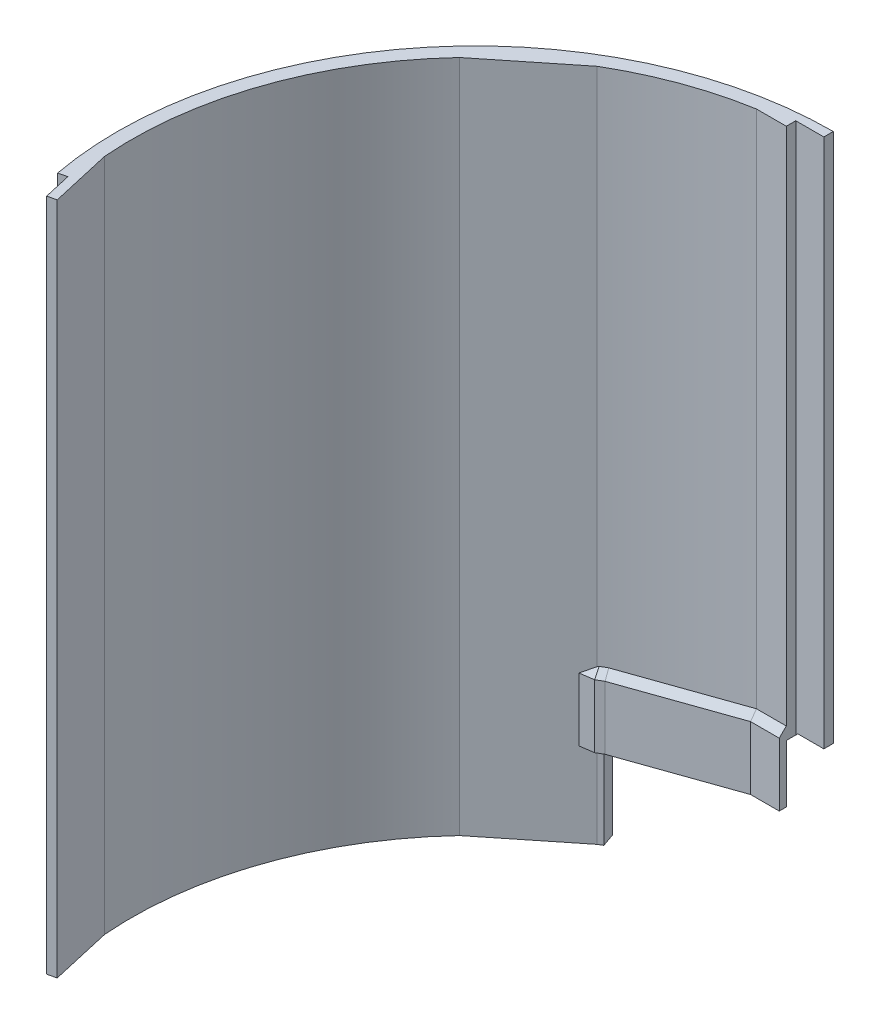
ISO-10303-21;
HEADER;
FILE_DESCRIPTION(('STEP AP214'),'2;1');
FILE_NAME('part.step','',(''),(''),'','','');
FILE_SCHEMA(('AUTOMOTIVE_DESIGN { 1 0 10303 214 1 1 1 1 }'));
ENDSEC;
DATA;
#1=APPLICATION_CONTEXT('core data for automotive mechanical design processes');
#2=APPLICATION_PROTOCOL_DEFINITION('international standard','automotive_design',2000,#1);
#3=PRODUCT_CONTEXT('',#1,'mechanical');
#4=PRODUCT('Part','Part','',(#3));
#5=PRODUCT_RELATED_PRODUCT_CATEGORY('part','',(#4));
#6=PRODUCT_DEFINITION_FORMATION('','',#4);
#7=PRODUCT_DEFINITION_CONTEXT('part definition',#1,'design');
#8=PRODUCT_DEFINITION('design','',#6,#7);
#9=PRODUCT_DEFINITION_SHAPE('','',#8);
#10=(LENGTH_UNIT() NAMED_UNIT(*) SI_UNIT(.MILLI.,.METRE.));
#11=(NAMED_UNIT(*) PLANE_ANGLE_UNIT() SI_UNIT($,.RADIAN.));
#12=(NAMED_UNIT(*) SI_UNIT($,.STERADIAN.) SOLID_ANGLE_UNIT());
#13=UNCERTAINTY_MEASURE_WITH_UNIT(LENGTH_MEASURE(1.E-05),#10,'distance_accuracy_value','');
#14=(GEOMETRIC_REPRESENTATION_CONTEXT(3) GLOBAL_UNCERTAINTY_ASSIGNED_CONTEXT((#13)) GLOBAL_UNIT_ASSIGNED_CONTEXT((#10,
#11,#12)) REPRESENTATION_CONTEXT('',''));
#15=CARTESIAN_POINT('',(0.,0.,0.));
#16=DIRECTION('',(0.,0.,1.));
#17=DIRECTION('',(1.,0.,0.));
#18=AXIS2_PLACEMENT_3D('',#15,#16,#17);
#19=CARTESIAN_POINT('',(0.,177.838869574608,0.));
#20=DIRECTION('',(0.,-1.,0.));
#21=DIRECTION('',(0.,0.,-1.));
#22=AXIS2_PLACEMENT_3D('',#19,#20,#21);
#23=CYLINDRICAL_SURFACE('',#22,49.);
#24=DIRECTION('',(0.,-1.,0.));
#25=VECTOR('',#24,1.);
#26=CARTESIAN_POINT('',(-23.8221858110528,22.,-42.8194285714286));
#27=LINE('',#26,#25);
#28=CARTESIAN_POINT('',(-23.8221858110528,22.,-42.8194285714286));
#29=VERTEX_POINT('',#28);
#30=CARTESIAN_POINT('',(-23.8221858110528,14.7071067811866,-42.8194285714286));
#31=VERTEX_POINT('',#30);
#32=EDGE_CURVE('E456',#29,#31,#27,.T.);
#33=ORIENTED_EDGE('',*,*,#32,.T.);
#34=CARTESIAN_POINT('',(0.,22.9599850669726,0.));
#35=DIRECTION('',(-0.666989294417188,0.707106781186547,0.234787736334038));
#36=DIRECTION('',(-0.666989294417188,-0.707106781186548,0.234787736334037));
#37=AXIS2_PLACEMENT_3D('',#34,#35,#36);
#38=ELLIPSE('',#37,69.2964645562817,49.);
#39=CARTESIAN_POINT('',(-21.3188530280703,17.5,-44.1192305640923));
#40=VERTEX_POINT('',#39);
#41=EDGE_CURVE('E507',#31,#40,#38,.F.);
#42=ORIENTED_EDGE('',*,*,#41,.T.);
#43=CARTESIAN_POINT('',(0.,17.5,0.));
#44=DIRECTION('',(0.,1.,0.));
#45=DIRECTION('',(0.,0.,1.));
#46=AXIS2_PLACEMENT_3D('',#43,#44,#45);
#47=CIRCLE('',#46,49.);
#48=CARTESIAN_POINT('',(-8.25287828578612,17.5,-48.3));
#49=VERTEX_POINT('',#48);
#50=EDGE_CURVE('E504',#40,#49,#47,.F.);
#51=ORIENTED_EDGE('',*,*,#50,.T.);
#52=DIRECTION('',(0.,-1.,0.));
#53=VECTOR('',#52,1.);
#54=CARTESIAN_POINT('',(-8.25287828578612,22.,-48.3));
#55=LINE('',#54,#53);
#56=CARTESIAN_POINT('',(-8.25287828578612,22.,-48.3));
#57=VERTEX_POINT('',#56);
#58=EDGE_CURVE('E463',#57,#49,#55,.T.);
#59=ORIENTED_EDGE('',*,*,#58,.F.);
#60=DIRECTION('',(0.,-1.,0.));
#61=VECTOR('',#60,1.);
#62=CARTESIAN_POINT('',(-8.25287828578612,177.838869574608,-48.3));
#63=LINE('',#62,#61);
#64=CARTESIAN_POINT('',(-8.25287828578612,96.,-48.3));
#65=VERTEX_POINT('',#64);
#66=EDGE_CURVE('E274',#65,#57,#63,.T.);
#67=ORIENTED_EDGE('',*,*,#66,.F.);
#68=CARTESIAN_POINT('',(0.,96.,0.));
#69=DIRECTION('',(0.,1.,0.));
#70=DIRECTION('',(0.,0.,1.));
#71=AXIS2_PLACEMENT_3D('',#68,#69,#70);
#72=CIRCLE('',#71,49.);
#73=CARTESIAN_POINT('',(-24.8620843048441,96.,-42.2241253789682));
#74=VERTEX_POINT('',#73);
#75=EDGE_CURVE('E364',#74,#65,#72,.F.);
#76=ORIENTED_EDGE('',*,*,#75,.F.);
#77=DIRECTION('',(0.,-1.,0.));
#78=VECTOR('',#77,1.);
#79=CARTESIAN_POINT('',(-24.8620843048441,177.838869574608,-42.2241253789682));
#80=LINE('',#79,#78);
#81=CARTESIAN_POINT('',(-24.8620843048441,21.9284345325406,-42.2241253789682));
#82=VERTEX_POINT('',#81);
#83=EDGE_CURVE('E100',#74,#82,#80,.T.);
#84=ORIENTED_EDGE('',*,*,#83,.T.);
#85=CARTESIAN_POINT('',(0.,-23.5648575619474,0.));
#86=DIRECTION('',(-0.106740245237132,-0.707106781186545,-0.699003948520121));
#87=DIRECTION('',(0.106740245237131,-0.70710678118655,0.699003948520117));
#88=AXIS2_PLACEMENT_3D('',#85,#86,#87);
#89=ELLIPSE('',#88,69.2964645562819,49.);
#90=CARTESIAN_POINT('',(-24.6950644021561,22.,-42.3220249299743));
#91=VERTEX_POINT('',#90);
#92=EDGE_CURVE('E12',#82,#91,#89,.T.);
#93=ORIENTED_EDGE('',*,*,#92,.T.);
#94=CARTESIAN_POINT('',(0.,22.,0.));
#95=DIRECTION('',(0.,1.,0.));
#96=DIRECTION('',(0.,0.,1.));
#97=AXIS2_PLACEMENT_3D('',#94,#95,#96);
#98=CIRCLE('',#97,49.);
#99=EDGE_CURVE('E448',#29,#91,#98,.T.);
#100=ORIENTED_EDGE('',*,*,#99,.F.);
#101=EDGE_LOOP('',(#33,#42,#51,#59,#67,#76,#84,#93,#100));
#102=FACE_BOUND('',#101,.T.);
#103=ADVANCED_FACE('F83',(#102),#23,.F.);
#104=CARTESIAN_POINT('',(0.,12.,0.));
#105=DIRECTION('',(0.,1.,0.));
#106=DIRECTION('',(0.,0.,1.));
#107=AXIS2_PLACEMENT_3D('',#104,#105,#106);
#108=CIRCLE('',#107,49.);
#109=CARTESIAN_POINT('',(-24.2645651205459,12.,-42.5703051376283));
#110=VERTEX_POINT('',#109);
#111=CARTESIAN_POINT('',(-24.8620843048441,12.,-42.2241253789682));
#112=VERTEX_POINT('',#111);
#113=EDGE_CURVE('E595',#110,#112,#108,.T.);
#114=ORIENTED_EDGE('',*,*,#113,.T.);
#115=CARTESIAN_POINT('',(-24.8620843048441,0.,-42.2241253789682));
#116=VERTEX_POINT('',#115);
#117=EDGE_CURVE('E409',#112,#116,#80,.T.);
#118=ORIENTED_EDGE('',*,*,#117,.T.);
#119=CARTESIAN_POINT('',(0.,0.,0.));
#120=DIRECTION('',(0.,1.,0.));
#121=DIRECTION('',(0.,0.,1.));
#122=AXIS2_PLACEMENT_3D('',#119,#120,#121);
#123=CIRCLE('',#122,49.);
#124=CARTESIAN_POINT('',(-24.2645651205459,0.,-42.5703051376283));
#125=VERTEX_POINT('',#124);
#126=EDGE_CURVE('E376',#116,#125,#123,.F.);
#127=ORIENTED_EDGE('',*,*,#126,.T.);
#128=DIRECTION('',(0.,-1.,0.));
#129=VECTOR('',#128,1.);
#130=CARTESIAN_POINT('',(-24.2645651205459,177.838869574608,-42.5703051376283));
#131=LINE('',#130,#129);
#132=EDGE_CURVE('E499',#125,#110,#131,.F.);
#133=ORIENTED_EDGE('',*,*,#132,.T.);
#134=EDGE_LOOP('',(#114,#118,#127,#133));
#135=FACE_BOUND('',#134,.T.);
#136=ADVANCED_FACE('F335',(#135),#23,.F.);
#137=CARTESIAN_POINT('',(0.,0.,0.));
#138=DIRECTION('',(0.,1.,0.));
#139=DIRECTION('',(0.,0.,1.));
#140=AXIS2_PLACEMENT_3D('',#137,#138,#139);
#141=PLANE('',#140);
#142=CARTESIAN_POINT('',(0.,0.,0.));
#143=DIRECTION('',(0.,1.,0.));
#144=DIRECTION('',(0.,0.,1.));
#145=AXIS2_PLACEMENT_3D('',#142,#143,#144);
#146=CIRCLE('',#145,51.);
#147=CARTESIAN_POINT('',(-24.9390649476221,0.,-44.4864365794597));
#148=VERTEX_POINT('',#147);
#149=CARTESIAN_POINT('',(-50.1311597152052,0.,9.37373061318611));
#150=VERTEX_POINT('',#149);
#151=EDGE_CURVE('E388',#148,#150,#146,.T.);
#152=ORIENTED_EDGE('',*,*,#151,.F.);
#153=DIRECTION('',(0.332040001002474,0.,0.943265306122449));
#154=VECTOR('',#153,1.);
#155=CARTESIAN_POINT('',(-8.25628641569455,0.,2.90630571478695));
#156=LINE('',#155,#154);
#157=EDGE_CURVE('E410',#148,#125,#156,.T.);
#158=ORIENTED_EDGE('',*,*,#157,.T.);
#159=ORIENTED_EDGE('',*,*,#126,.F.);
#160=DIRECTION('',(0.7806247497998,0.,-0.625));
#161=VECTOR('',#160,1.);
#162=CARTESIAN_POINT('',(-30.3125,0.,-37.8603003652903));
#163=LINE('',#162,#161);
#164=CARTESIAN_POINT('',(-35.7629156951558,0.,-33.4964753516124));
#165=VERTEX_POINT('',#164);
#166=EDGE_CURVE('E407',#165,#116,#163,.T.);
#167=ORIENTED_EDGE('',*,*,#166,.F.);
#168=CARTESIAN_POINT('',(0.,0.,0.));
#169=DIRECTION('',(0.,1.,0.));
#170=DIRECTION('',(0.,0.,1.));
#171=AXIS2_PLACEMENT_3D('',#168,#169,#170);
#172=CIRCLE('',#171,49.);
#173=CARTESIAN_POINT('',(-48.8389610049885,0.,3.96936870965767));
#174=VERTEX_POINT('',#173);
#175=EDGE_CURVE('E404',#174,#165,#172,.F.);
#176=ORIENTED_EDGE('',*,*,#175,.F.);
#177=DIRECTION('',(-0.222204860432889,0.,-0.975));
#178=VECTOR('',#177,1.);
#179=CARTESIAN_POINT('',(-47.2875,0.,10.7769357309951));
#180=LINE('',#179,#178);
#181=CARTESIAN_POINT('',(-46.8430902791342,0.,12.7269357309953));
#182=VERTEX_POINT('',#181);
#183=EDGE_CURVE('E401',#182,#174,#180,.T.);
#184=ORIENTED_EDGE('',*,*,#183,.F.);
#185=DIRECTION('',(-0.975,0.,0.222204860432889));
#186=VECTOR('',#185,1.);
#187=CARTESIAN_POINT('',(0.44440972086582,0.,1.95000000000019));
#188=LINE('',#187,#186);
#189=CARTESIAN_POINT('',(-48.0618402791341,0.,13.0046918065364));
#190=VERTEX_POINT('',#189);
#191=EDGE_CURVE('E513',#182,#190,#188,.T.);
#192=ORIENTED_EDGE('',*,*,#191,.T.);
#193=DIRECTION('',(-0.222204860432907,0.,-0.974999999999996));
#194=VECTOR('',#193,1.);
#195=CARTESIAN_POINT('',(-48.5062499999998,0.,11.0546918065371));
#196=LINE('',#195,#194);
#197=CARTESIAN_POINT('',(-48.9506597208657,0.,9.10469180653663));
#198=VERTEX_POINT('',#197);
#199=EDGE_CURVE('E372',#190,#198,#196,.T.);
#200=ORIENTED_EDGE('',*,*,#199,.T.);
#201=DIRECTION('',(-0.975,0.,0.222204860432891));
#202=VECTOR('',#201,1.);
#203=CARTESIAN_POINT('',(-0.444409720865719,0.,-1.94999999999972));
#204=LINE('',#203,#202);
#205=EDGE_CURVE('E367',#198,#150,#204,.T.);
#206=ORIENTED_EDGE('',*,*,#205,.T.);
#207=EDGE_LOOP('',(#152,#158,#159,#167,#176,#184,#192,#200,#206));
#208=FACE_BOUND('',#207,.T.);
#209=ADVANCED_FACE('F340',(#208),#141,.F.);
#210=CARTESIAN_POINT('',(0.,177.838869574608,-48.3));
#211=DIRECTION('',(0.,0.,-1.));
#212=DIRECTION('',(-1.,0.,0.));
#213=AXIS2_PLACEMENT_3D('',#210,#211,#212);
#214=PLANE('',#213);
#215=ORIENTED_EDGE('',*,*,#66,.T.);
#216=DIRECTION('',(-1.,0.,0.));
#217=VECTOR('',#216,1.);
#218=CARTESIAN_POINT('',(0.,22.,-48.3));
#219=LINE('',#218,#217);
#220=CARTESIAN_POINT('',(-3.99999999999999,22.,-48.3));
#221=VERTEX_POINT('',#220);
#222=EDGE_CURVE('E269',#221,#57,#219,.T.);
#223=ORIENTED_EDGE('',*,*,#222,.F.);
#224=DIRECTION('',(0.,-1.,0.));
#225=VECTOR('',#224,1.);
#226=CARTESIAN_POINT('',(-3.99999999999999,177.838869574608,-48.3));
#227=LINE('',#226,#225);
#228=CARTESIAN_POINT('',(-3.99999999999999,96.,-48.3));
#229=VERTEX_POINT('',#228);
#230=EDGE_CURVE('E271',#229,#221,#227,.T.);
#231=ORIENTED_EDGE('',*,*,#230,.F.);
#232=DIRECTION('',(1.,0.,0.));
#233=VECTOR('',#232,1.);
#234=CARTESIAN_POINT('',(0.,96.,-48.3));
#235=LINE('',#234,#233);
#236=EDGE_CURVE('E369',#65,#229,#235,.T.);
#237=ORIENTED_EDGE('',*,*,#236,.F.);
#238=EDGE_LOOP('',(#215,#223,#231,#237));
#239=FACE_BOUND('',#238,.T.);
#240=ADVANCED_FACE('F270',(#239),#214,.F.);
#241=CARTESIAN_POINT('',(-3.99999999999999,177.838869574608,0.));
#242=DIRECTION('',(1.,0.,0.));
#243=DIRECTION('',(0.,0.,-1.));
#244=AXIS2_PLACEMENT_3D('',#241,#242,#243);
#245=PLANE('',#244);
#246=ORIENTED_EDGE('',*,*,#230,.T.);
#247=DIRECTION('',(0.,-0.707106781186552,0.707106781186543));
#248=VECTOR('',#247,1.);
#249=CARTESIAN_POINT('',(-3.99999999999999,75.7694347873051,-102.069434787304));
#250=LINE('',#249,#248);
#251=CARTESIAN_POINT('',(-4.,21.,-47.3));
#252=VERTEX_POINT('',#251);
#253=EDGE_CURVE('E108',#221,#252,#250,.T.);
#254=ORIENTED_EDGE('',*,*,#253,.T.);
#255=DIRECTION('',(0.,-1.,0.));
#256=VECTOR('',#255,1.);
#257=CARTESIAN_POINT('',(-4.,22.,-47.3));
#258=LINE('',#257,#256);
#259=CARTESIAN_POINT('',(-4.,12.,-47.3));
#260=VERTEX_POINT('',#259);
#261=EDGE_CURVE('E468',#252,#260,#258,.T.);
#262=ORIENTED_EDGE('',*,*,#261,.T.);
#263=DIRECTION('',(0.,0.,1.));
#264=VECTOR('',#263,1.);
#265=CARTESIAN_POINT('',(-4.00000000000045,12.,0.));
#266=LINE('',#265,#264);
#267=CARTESIAN_POINT('',(-3.99999999999999,12.,-48.3));
#268=VERTEX_POINT('',#267);
#269=EDGE_CURVE('E605',#268,#260,#266,.T.);
#270=ORIENTED_EDGE('',*,*,#269,.F.);
#271=DIRECTION('',(0.,-1.,0.));
#272=VECTOR('',#271,1.);
#273=CARTESIAN_POINT('',(-3.99999999999999,22.,-48.3));
#274=LINE('',#273,#272);
#275=CARTESIAN_POINT('',(-3.99999999999999,20.2071067811866,-48.3));
#276=VERTEX_POINT('',#275);
#277=EDGE_CURVE('E466',#276,#268,#274,.T.);
#278=ORIENTED_EDGE('',*,*,#277,.F.);
#279=DIRECTION('',(0.,0.,1.));
#280=VECTOR('',#279,1.);
#281=CARTESIAN_POINT('',(-3.99999999999999,20.2071067811866,0.));
#282=LINE('',#281,#280);
#283=CARTESIAN_POINT('',(-3.99999999999999,20.2071067811865,-49.65));
#284=VERTEX_POINT('',#283);
#285=EDGE_CURVE('E485',#284,#276,#282,.T.);
#286=ORIENTED_EDGE('',*,*,#285,.F.);
#287=DIRECTION('',(0.,-1.,0.));
#288=VECTOR('',#287,1.);
#289=CARTESIAN_POINT('',(-3.99999999999999,177.838869574608,-49.65));
#290=LINE('',#289,#288);
#291=CARTESIAN_POINT('',(-3.99999999999999,96.,-49.65));
#292=VERTEX_POINT('',#291);
#293=EDGE_CURVE('E378',#292,#284,#290,.T.);
#294=ORIENTED_EDGE('',*,*,#293,.F.);
#295=DIRECTION('',(0.,0.,1.));
#296=VECTOR('',#295,1.);
#297=CARTESIAN_POINT('',(-3.99999999999999,96.,0.));
#298=LINE('',#297,#296);
#299=EDGE_CURVE('E284',#292,#229,#298,.T.);
#300=ORIENTED_EDGE('',*,*,#299,.T.);
#301=EDGE_LOOP('',(#246,#254,#262,#270,#278,#286,#294,#300));
#302=FACE_BOUND('',#301,.T.);
#303=ADVANCED_FACE('F281',(#302),#245,.T.);
#304=CARTESIAN_POINT('',(0.,177.838869574608,-49.65));
#305=DIRECTION('',(0.,0.,1.));
#306=DIRECTION('',(1.,0.,0.));
#307=AXIS2_PLACEMENT_3D('',#304,#305,#306);
#308=PLANE('',#307);
#309=DIRECTION('',(-1.,0.,0.));
#310=VECTOR('',#309,1.);
#311=CARTESIAN_POINT('',(-1.47251992912578E-13,20.5,-49.65));
#312=LINE('',#311,#310);
#313=CARTESIAN_POINT('',(0.,20.5,-49.65));
#314=VERTEX_POINT('',#313);
#315=CARTESIAN_POINT('',(-3.70710678118655,20.5,-49.65));
#316=VERTEX_POINT('',#315);
#317=EDGE_CURVE('E488',#314,#316,#312,.T.);
#318=ORIENTED_EDGE('',*,*,#317,.F.);
#319=DIRECTION('',(0.,-1.,0.));
#320=VECTOR('',#319,1.);
#321=CARTESIAN_POINT('',(0.,177.838869574608,-49.65));
#322=LINE('',#321,#320);
#323=CARTESIAN_POINT('',(0.,96.,-49.65));
#324=VERTEX_POINT('',#323);
#325=EDGE_CURVE('E382',#324,#314,#322,.T.);
#326=ORIENTED_EDGE('',*,*,#325,.F.);
#327=DIRECTION('',(-1.,0.,0.));
#328=VECTOR('',#327,1.);
#329=CARTESIAN_POINT('',(0.,96.,-49.65));
#330=LINE('',#329,#328);
#331=EDGE_CURVE('E285',#324,#292,#330,.T.);
#332=ORIENTED_EDGE('',*,*,#331,.T.);
#333=ORIENTED_EDGE('',*,*,#293,.T.);
#334=DIRECTION('',(-0.70710678118655,-0.707106781186545,0.));
#335=VECTOR('',#334,1.);
#336=CARTESIAN_POINT('',(76.8158813967108,101.022988177897,-49.65));
#337=LINE('',#336,#335);
#338=EDGE_CURVE('E479',#316,#284,#337,.T.);
#339=ORIENTED_EDGE('',*,*,#338,.F.);
#340=EDGE_LOOP('',(#318,#326,#332,#333,#339));
#341=FACE_BOUND('',#340,.T.);
#342=ADVANCED_FACE('F559',(#341),#308,.T.);
#343=CARTESIAN_POINT('',(0.,177.838869574608,0.));
#344=DIRECTION('',(1.,0.,0.));
#345=DIRECTION('',(0.,0.,-1.));
#346=AXIS2_PLACEMENT_3D('',#343,#344,#345);
#347=PLANE('',#346);
#348=DIRECTION('',(0.,0.,1.));
#349=VECTOR('',#348,1.);
#350=CARTESIAN_POINT('',(0.,20.5,-51.));
#351=LINE('',#350,#349);
#352=CARTESIAN_POINT('',(0.,20.5,-51.));
#353=VERTEX_POINT('',#352);
#354=EDGE_CURVE('E475',#353,#314,#351,.T.);
#355=ORIENTED_EDGE('',*,*,#354,.F.);
#356=DIRECTION('',(0.,-1.,0.));
#357=VECTOR('',#356,1.);
#358=CARTESIAN_POINT('',(0.,177.838869574608,-51.));
#359=LINE('',#358,#357);
#360=CARTESIAN_POINT('',(0.,96.,-51.));
#361=VERTEX_POINT('',#360);
#362=EDGE_CURVE('E385',#361,#353,#359,.T.);
#363=ORIENTED_EDGE('',*,*,#362,.F.);
#364=DIRECTION('',(0.,0.,1.));
#365=VECTOR('',#364,1.);
#366=CARTESIAN_POINT('',(0.,96.,0.));
#367=LINE('',#366,#365);
#368=EDGE_CURVE('E381',#361,#324,#367,.T.);
#369=ORIENTED_EDGE('',*,*,#368,.T.);
#370=ORIENTED_EDGE('',*,*,#325,.T.);
#371=EDGE_LOOP('',(#355,#363,#369,#370));
#372=FACE_BOUND('',#371,.T.);
#373=ADVANCED_FACE('F566',(#372),#347,.T.);
#374=CARTESIAN_POINT('',(0.,177.838869574608,0.));
#375=DIRECTION('',(0.,-1.,0.));
#376=DIRECTION('',(0.,0.,-1.));
#377=AXIS2_PLACEMENT_3D('',#374,#375,#376);
#378=CYLINDRICAL_SURFACE('',#377,51.);
#379=ORIENTED_EDGE('',*,*,#362,.T.);
#380=CARTESIAN_POINT('',(0.,20.5,0.));
#381=DIRECTION('',(0.,1.,0.));
#382=DIRECTION('',(-1.,0.,0.));
#383=AXIS2_PLACEMENT_3D('',#380,#381,#382);
#384=CIRCLE('',#383,51.);
#385=CARTESIAN_POINT('',(-3.70710678118655,20.5,-50.8650897896866));
#386=VERTEX_POINT('',#385);
#387=EDGE_CURVE('E421',#353,#386,#384,.T.);
#388=ORIENTED_EDGE('',*,*,#387,.T.);
#389=CARTESIAN_POINT('',(0.,24.2071067811865,0.));
#390=DIRECTION('',(-0.707106781186545,0.70710678118655,0.));
#391=DIRECTION('',(-0.70710678118655,-0.707106781186545,0.));
#392=AXIS2_PLACEMENT_3D('',#389,#390,#391);
#393=ELLIPSE('',#392,72.1248916810276,51.);
#394=CARTESIAN_POINT('',(-6.70710678118656,17.5,-50.5570442038076));
#395=VERTEX_POINT('',#394);
#396=EDGE_CURVE('E418',#386,#395,#393,.T.);
#397=ORIENTED_EDGE('',*,*,#396,.T.);
#398=CARTESIAN_POINT('',(0.,17.5,0.));
#399=DIRECTION('',(0.,1.,0.));
#400=DIRECTION('',(0.,0.,1.));
#401=AXIS2_PLACEMENT_3D('',#398,#399,#400);
#402=CIRCLE('',#401,51.);
#403=CARTESIAN_POINT('',(-21.9869298650982,17.5,-46.0171154583515));
#404=VERTEX_POINT('',#403);
#405=EDGE_CURVE('E413',#395,#404,#402,.T.);
#406=ORIENTED_EDGE('',*,*,#405,.T.);
#407=CARTESIAN_POINT('',(0.,22.9599850669726,0.));
#408=DIRECTION('',(-0.666989294417188,0.707106781186547,0.234787736334038));
#409=DIRECTION('',(-0.666989294417188,-0.707106781186548,0.234787736334037));
#410=AXIS2_PLACEMENT_3D('',#407,#408,#409);
#411=ELLIPSE('',#410,72.1248916810279,51.);
#412=CARTESIAN_POINT('',(-24.9390649476221,14.2071067811865,-44.4864365794596));
#413=VERTEX_POINT('',#412);
#414=EDGE_CURVE('E415',#404,#413,#411,.T.);
#415=ORIENTED_EDGE('',*,*,#414,.T.);
#416=DIRECTION('',(0.,-1.,0.));
#417=VECTOR('',#416,1.);
#418=CARTESIAN_POINT('',(-24.9390649476221,177.838869574608,-44.4864365794597));
#419=LINE('',#418,#417);
#420=EDGE_CURVE('E493',#413,#148,#419,.T.);
#421=ORIENTED_EDGE('',*,*,#420,.T.);
#422=ORIENTED_EDGE('',*,*,#151,.T.);
#423=DIRECTION('',(0.,-1.,0.));
#424=VECTOR('',#423,1.);
#425=CARTESIAN_POINT('',(-50.1311597152052,177.838869574608,9.37373061318611));
#426=LINE('',#425,#424);
#427=CARTESIAN_POINT('',(-50.1311597152052,96.,9.37373061318611));
#428=VERTEX_POINT('',#427);
#429=EDGE_CURVE('E389',#428,#150,#426,.T.);
#430=ORIENTED_EDGE('',*,*,#429,.F.);
#431=CARTESIAN_POINT('',(0.,96.,0.));
#432=DIRECTION('',(0.,1.,0.));
#433=DIRECTION('',(0.,0.,1.));
#434=AXIS2_PLACEMENT_3D('',#431,#432,#433);
#435=CIRCLE('',#434,51.);
#436=EDGE_CURVE('E528',#361,#428,#435,.T.);
#437=ORIENTED_EDGE('',*,*,#436,.F.);
#438=EDGE_LOOP('',(#379,#388,#397,#406,#415,#421,#422,#430,#437));
#439=FACE_BOUND('',#438,.T.);
#440=ADVANCED_FACE('F568',(#439),#378,.T.);
#441=CARTESIAN_POINT('',(-0.444409720865719,177.838869574608,-1.94999999999972));
#442=DIRECTION('',(0.222204860432891,0.,0.975));
#443=DIRECTION('',(0.975,0.,-0.222204860432891));
#444=AXIS2_PLACEMENT_3D('',#441,#442,#443);
#445=PLANE('',#444);
#446=DIRECTION('',(0.,-1.,0.));
#447=VECTOR('',#446,1.);
#448=CARTESIAN_POINT('',(-48.9506597208657,177.838869574608,9.10469180653663));
#449=LINE('',#448,#447);
#450=CARTESIAN_POINT('',(-48.9506597208657,96.,9.10469180653663));
#451=VERTEX_POINT('',#450);
#452=EDGE_CURVE('E394',#451,#198,#449,.T.);
#453=ORIENTED_EDGE('',*,*,#452,.F.);
#454=DIRECTION('',(-0.975,0.,0.222204860432891));
#455=VECTOR('',#454,1.);
#456=CARTESIAN_POINT('',(-0.444409720865719,96.,-1.94999999999972));
#457=LINE('',#456,#455);
#458=EDGE_CURVE('E393',#451,#428,#457,.T.);
#459=ORIENTED_EDGE('',*,*,#458,.T.);
#460=ORIENTED_EDGE('',*,*,#429,.T.);
#461=ORIENTED_EDGE('',*,*,#205,.F.);
#462=EDGE_LOOP('',(#453,#459,#460,#461));
#463=FACE_BOUND('',#462,.T.);
#464=ADVANCED_FACE('F574',(#463),#445,.T.);
#465=CARTESIAN_POINT('',(-48.5062499999998,177.838869574608,11.0546918065371));
#466=DIRECTION('',(-0.974999999999996,0.,0.222204860432907));
#467=DIRECTION('',(0.222204860432907,0.,0.974999999999996));
#468=AXIS2_PLACEMENT_3D('',#465,#466,#467);
#469=PLANE('',#468);
#470=DIRECTION('',(0.,-1.,0.));
#471=VECTOR('',#470,1.);
#472=CARTESIAN_POINT('',(-48.0618402791341,177.838869574608,13.0046918065364));
#473=LINE('',#472,#471);
#474=CARTESIAN_POINT('',(-48.0618402791341,96.,13.0046918065364));
#475=VERTEX_POINT('',#474);
#476=EDGE_CURVE('E397',#475,#190,#473,.T.);
#477=ORIENTED_EDGE('',*,*,#476,.F.);
#478=DIRECTION('',(-0.222204860432907,0.,-0.974999999999996));
#479=VECTOR('',#478,1.);
#480=CARTESIAN_POINT('',(-48.5062499999998,96.,11.0546918065371));
#481=LINE('',#480,#479);
#482=EDGE_CURVE('E392',#475,#451,#481,.T.);
#483=ORIENTED_EDGE('',*,*,#482,.T.);
#484=ORIENTED_EDGE('',*,*,#452,.T.);
#485=ORIENTED_EDGE('',*,*,#199,.F.);
#486=EDGE_LOOP('',(#477,#483,#484,#485));
#487=FACE_BOUND('',#486,.T.);
#488=ADVANCED_FACE('F581',(#487),#469,.T.);
#489=CARTESIAN_POINT('',(0.44440972086582,177.838869574608,1.95000000000019));
#490=DIRECTION('',(0.222204860432889,0.,0.975));
#491=DIRECTION('',(0.975,0.,-0.222204860432889));
#492=AXIS2_PLACEMENT_3D('',#489,#490,#491);
#493=PLANE('',#492);
#494=DIRECTION('',(0.,-1.,0.));
#495=VECTOR('',#494,1.);
#496=CARTESIAN_POINT('',(-46.8430902791342,177.838869574608,12.7269357309953));
#497=LINE('',#496,#495);
#498=CARTESIAN_POINT('',(-46.8430902791342,96.,12.7269357309953));
#499=VERTEX_POINT('',#498);
#500=EDGE_CURVE('E399',#499,#182,#497,.T.);
#501=ORIENTED_EDGE('',*,*,#500,.F.);
#502=DIRECTION('',(-0.975,0.,0.222204860432889));
#503=VECTOR('',#502,1.);
#504=CARTESIAN_POINT('',(0.44440972086582,96.,1.95000000000019));
#505=LINE('',#504,#503);
#506=EDGE_CURVE('E396',#499,#475,#505,.T.);
#507=ORIENTED_EDGE('',*,*,#506,.T.);
#508=ORIENTED_EDGE('',*,*,#476,.T.);
#509=ORIENTED_EDGE('',*,*,#191,.F.);
#510=EDGE_LOOP('',(#501,#507,#508,#509));
#511=FACE_BOUND('',#510,.T.);
#512=ADVANCED_FACE('F586',(#511),#493,.T.);
#513=CARTESIAN_POINT('',(-47.2875,177.838869574608,10.7769357309951));
#514=DIRECTION('',(-0.975,0.,0.222204860432889));
#515=DIRECTION('',(0.222204860432889,0.,0.975));
#516=AXIS2_PLACEMENT_3D('',#513,#514,#515);
#517=PLANE('',#516);
#518=DIRECTION('',(-0.222204860432889,0.,-0.975));
#519=VECTOR('',#518,1.);
#520=CARTESIAN_POINT('',(-47.2875,96.,10.7769357309951));
#521=LINE('',#520,#519);
#522=CARTESIAN_POINT('',(-48.8389610049885,96.,3.96936870965767));
#523=VERTEX_POINT('',#522);
#524=EDGE_CURVE('E526',#499,#523,#521,.T.);
#525=ORIENTED_EDGE('',*,*,#524,.F.);
#526=ORIENTED_EDGE('',*,*,#500,.T.);
#527=ORIENTED_EDGE('',*,*,#183,.T.);
#528=DIRECTION('',(0.,-1.,0.));
#529=VECTOR('',#528,1.);
#530=CARTESIAN_POINT('',(-48.8389610049885,177.838869574608,3.96936870965767));
#531=LINE('',#530,#529);
#532=EDGE_CURVE('E402',#523,#174,#531,.T.);
#533=ORIENTED_EDGE('',*,*,#532,.F.);
#534=EDGE_LOOP('',(#525,#526,#527,#533));
#535=FACE_BOUND('',#534,.T.);
#536=ADVANCED_FACE('F588',(#535),#517,.F.);
#537=CARTESIAN_POINT('',(0.,177.838869574608,0.));
#538=DIRECTION('',(0.,-1.,0.));
#539=DIRECTION('',(0.,0.,-1.));
#540=AXIS2_PLACEMENT_3D('',#537,#538,#539);
#541=CYLINDRICAL_SURFACE('',#540,49.);
#542=CARTESIAN_POINT('',(0.,96.,0.));
#543=DIRECTION('',(0.,1.,0.));
#544=DIRECTION('',(0.,0.,1.));
#545=AXIS2_PLACEMENT_3D('',#542,#543,#544);
#546=CIRCLE('',#545,49.);
#547=CARTESIAN_POINT('',(-35.7629156951558,96.,-33.4964753516124));
#548=VERTEX_POINT('',#547);
#549=EDGE_CURVE('E366',#523,#548,#546,.F.);
#550=ORIENTED_EDGE('',*,*,#549,.F.);
#551=ORIENTED_EDGE('',*,*,#532,.T.);
#552=ORIENTED_EDGE('',*,*,#175,.T.);
#553=DIRECTION('',(0.,-1.,0.));
#554=VECTOR('',#553,1.);
#555=CARTESIAN_POINT('',(-35.7629156951558,177.838869574608,-33.4964753516124));
#556=LINE('',#555,#554);
#557=EDGE_CURVE('E405',#548,#165,#556,.T.);
#558=ORIENTED_EDGE('',*,*,#557,.F.);
#559=EDGE_LOOP('',(#550,#551,#552,#558));
#560=FACE_BOUND('',#559,.T.);
#561=ADVANCED_FACE('F356',(#560),#541,.F.);
#562=CARTESIAN_POINT('',(-30.3125,177.838869574608,-37.8603003652903));
#563=DIRECTION('',(-0.625,0.,-0.7806247497998));
#564=DIRECTION('',(-0.7806247497998,0.,0.625));
#565=AXIS2_PLACEMENT_3D('',#562,#563,#564);
#566=PLANE('',#565);
#567=DIRECTION('',(0.,-1.,0.));
#568=VECTOR('',#567,1.);
#569=CARTESIAN_POINT('',(-26.3116022541842,22.,-41.0635822132923));
#570=LINE('',#569,#568);
#571=CARTESIAN_POINT('',(-26.3116022541842,21.,-41.0635822132923));
#572=VERTEX_POINT('',#571);
#573=CARTESIAN_POINT('',(-26.3116022541842,12.,-41.0635822132923));
#574=VERTEX_POINT('',#573);
#575=EDGE_CURVE('E451',#572,#574,#570,.T.);
#576=ORIENTED_EDGE('',*,*,#575,.F.);
#577=DIRECTION('',(-0.698212002188448,-0.447213595499956,0.559016994374948));
#578=VECTOR('',#577,1.);
#579=CARTESIAN_POINT('',(19.4606008773877,50.3176735322,-77.7106741285426));
#580=LINE('',#579,#578);
#581=EDGE_CURVE('E93',#572,#82,#580,.F.);
#582=ORIENTED_EDGE('',*,*,#581,.T.);
#583=ORIENTED_EDGE('',*,*,#83,.F.);
#584=DIRECTION('',(0.7806247497998,0.,-0.625));
#585=VECTOR('',#584,1.);
#586=CARTESIAN_POINT('',(-30.3125,96.,-37.8603003652903));
#587=LINE('',#586,#585);
#588=EDGE_CURVE('E363',#548,#74,#587,.T.);
#589=ORIENTED_EDGE('',*,*,#588,.F.);
#590=ORIENTED_EDGE('',*,*,#557,.T.);
#591=ORIENTED_EDGE('',*,*,#166,.T.);
#592=ORIENTED_EDGE('',*,*,#117,.F.);
#593=DIRECTION('',(-0.7806247497998,0.,0.625));
#594=VECTOR('',#593,1.);
#595=CARTESIAN_POINT('',(-30.3125,12.,-37.8603003652903));
#596=LINE('',#595,#594);
#597=EDGE_CURVE('E279',#112,#574,#596,.T.);
#598=ORIENTED_EDGE('',*,*,#597,.T.);
#599=EDGE_LOOP('',(#576,#582,#583,#589,#590,#591,#592,#598));
#600=FACE_BOUND('',#599,.T.);
#601=ADVANCED_FACE('F347',(#600),#566,.F.);
#602=CARTESIAN_POINT('',(0.,96.,0.));
#603=DIRECTION('',(0.,1.,0.));
#604=DIRECTION('',(0.,0.,1.));
#605=AXIS2_PLACEMENT_3D('',#602,#603,#604);
#606=PLANE('',#605);
#607=ORIENTED_EDGE('',*,*,#588,.T.);
#608=ORIENTED_EDGE('',*,*,#75,.T.);
#609=ORIENTED_EDGE('',*,*,#236,.T.);
#610=ORIENTED_EDGE('',*,*,#299,.F.);
#611=ORIENTED_EDGE('',*,*,#331,.F.);
#612=ORIENTED_EDGE('',*,*,#368,.F.);
#613=ORIENTED_EDGE('',*,*,#436,.T.);
#614=ORIENTED_EDGE('',*,*,#458,.F.);
#615=ORIENTED_EDGE('',*,*,#482,.F.);
#616=ORIENTED_EDGE('',*,*,#506,.F.);
#617=ORIENTED_EDGE('',*,*,#524,.T.);
#618=ORIENTED_EDGE('',*,*,#549,.T.);
#619=EDGE_LOOP('',(#607,#608,#609,#610,#611,#612,#613,#614,#615,#616,#617,#618));
#620=FACE_BOUND('',#619,.T.);
#621=ADVANCED_FACE('F344',(#620),#606,.T.);
#622=CARTESIAN_POINT('',(-26.7462856338892,17.5,-59.5375803500524));
#623=DIRECTION('',(-0.666989294417188,0.707106781186547,0.234787736334038));
#624=DIRECTION('',(-0.72744118844636,-0.686170035305934,0.));
#625=AXIS2_PLACEMENT_3D('',#622,#623,#624);
#626=PLANE('',#625);
#627=DIRECTION('',(0.332040001002474,0.,0.943265306122449));
#628=VECTOR('',#627,1.);
#629=CARTESIAN_POINT('',(-29.8523575639618,14.2071067811865,-58.4442080823765));
#630=LINE('',#629,#628);
#631=CARTESIAN_POINT('',(-24.2645651205459,14.2071067811865,-42.5703051376283));
#632=VERTEX_POINT('',#631);
#633=EDGE_CURVE('E491',#413,#632,#630,.T.);
#634=ORIENTED_EDGE('',*,*,#633,.F.);
#635=ORIENTED_EDGE('',*,*,#414,.F.);
#636=DIRECTION('',(0.332040001002474,0.,0.943265306122449));
#637=VECTOR('',#636,1.);
#638=CARTESIAN_POINT('',(-26.7462856338892,17.5,-59.5375803500524));
#639=LINE('',#638,#637);
#640=EDGE_CURVE('E490',#404,#40,#639,.T.);
#641=ORIENTED_EDGE('',*,*,#640,.T.);
#642=ORIENTED_EDGE('',*,*,#41,.F.);
#643=EDGE_CURVE('E508',#632,#31,#38,.F.);
#644=ORIENTED_EDGE('',*,*,#643,.F.);
#645=EDGE_LOOP('',(#634,#635,#641,#642,#644));
#646=FACE_BOUND('',#645,.T.);
#647=ADVANCED_FACE('F346',(#646),#626,.F.);
#648=CARTESIAN_POINT('',(-13.3397847325726,17.5,-64.2568195119504));
#649=DIRECTION('',(0.,1.,0.));
#650=DIRECTION('',(0.,0.,1.));
#651=AXIS2_PLACEMENT_3D('',#648,#649,#650);
#652=PLANE('',#651);
#653=DIRECTION('',(1.,0.,0.));
#654=VECTOR('',#653,1.);
#655=CARTESIAN_POINT('',(0.,17.5,-48.3));
#656=LINE('',#655,#654);
#657=CARTESIAN_POINT('',(-6.70710678118657,17.5,-48.3));
#658=VERTEX_POINT('',#657);
#659=EDGE_CURVE('E502',#49,#658,#656,.T.);
#660=ORIENTED_EDGE('',*,*,#659,.F.);
#661=ORIENTED_EDGE('',*,*,#50,.F.);
#662=ORIENTED_EDGE('',*,*,#640,.F.);
#663=ORIENTED_EDGE('',*,*,#405,.F.);
#664=DIRECTION('',(0.,0.,1.));
#665=VECTOR('',#664,1.);
#666=CARTESIAN_POINT('',(-6.70710678118657,17.5,-51.));
#667=LINE('',#666,#665);
#668=EDGE_CURVE('E476',#395,#658,#667,.T.);
#669=ORIENTED_EDGE('',*,*,#668,.T.);
#670=EDGE_LOOP('',(#660,#661,#662,#663,#669));
#671=FACE_BOUND('',#670,.T.);
#672=ADVANCED_FACE('F353',(#671),#652,.F.);
#673=CARTESIAN_POINT('',(-29.8523575639618,14.2071067811865,-58.4442080823765));
#674=DIRECTION('',(-0.943265306122449,0.,0.332040001002474));
#675=DIRECTION('',(0.332040001002474,0.,0.943265306122449));
#676=AXIS2_PLACEMENT_3D('',#673,#674,#675);
#677=PLANE('',#676);
#678=ORIENTED_EDGE('',*,*,#157,.F.);
#679=ORIENTED_EDGE('',*,*,#420,.F.);
#680=ORIENTED_EDGE('',*,*,#633,.T.);
#681=EDGE_CURVE('E498',#110,#632,#131,.F.);
#682=ORIENTED_EDGE('',*,*,#681,.F.);
#683=ORIENTED_EDGE('',*,*,#132,.F.);
#684=EDGE_LOOP('',(#678,#679,#680,#682,#683));
#685=FACE_BOUND('',#684,.T.);
#686=ADVANCED_FACE('F639',(#685),#677,.F.);
#687=CARTESIAN_POINT('',(0.,20.5,-51.));
#688=DIRECTION('',(0.,1.,0.));
#689=DIRECTION('',(-1.,0.,0.));
#690=AXIS2_PLACEMENT_3D('',#687,#688,#689);
#691=PLANE('',#690);
#692=ORIENTED_EDGE('',*,*,#317,.T.);
#693=DIRECTION('',(0.,0.,1.));
#694=VECTOR('',#693,1.);
#695=CARTESIAN_POINT('',(-3.70710678118655,20.5,-51.));
#696=LINE('',#695,#694);
#697=EDGE_CURVE('E480',#386,#316,#696,.T.);
#698=ORIENTED_EDGE('',*,*,#697,.F.);
#699=ORIENTED_EDGE('',*,*,#387,.F.);
#700=ORIENTED_EDGE('',*,*,#354,.T.);
#701=EDGE_LOOP('',(#692,#698,#699,#700));
#702=FACE_BOUND('',#701,.T.);
#703=ADVANCED_FACE('F637',(#702),#691,.F.);
#704=CARTESIAN_POINT('',(-12.1035533905933,12.1035533905933,-51.));
#705=DIRECTION('',(-0.707106781186545,0.70710678118655,0.));
#706=DIRECTION('',(-0.70710678118655,-0.707106781186545,0.));
#707=AXIS2_PLACEMENT_3D('',#704,#705,#706);
#708=PLANE('',#707);
#709=ORIENTED_EDGE('',*,*,#285,.T.);
#710=DIRECTION('',(-0.70710678118655,-0.707106781186545,0.));
#711=VECTOR('',#710,1.);
#712=CARTESIAN_POINT('',(-12.1035533905933,12.1035533905933,-48.3));
#713=LINE('',#712,#711);
#714=EDGE_CURVE('E445',#276,#658,#713,.T.);
#715=ORIENTED_EDGE('',*,*,#714,.T.);
#716=ORIENTED_EDGE('',*,*,#668,.F.);
#717=ORIENTED_EDGE('',*,*,#396,.F.);
#718=ORIENTED_EDGE('',*,*,#697,.T.);
#719=ORIENTED_EDGE('',*,*,#338,.T.);
#720=EDGE_LOOP('',(#709,#715,#716,#717,#718,#719));
#721=FACE_BOUND('',#720,.T.);
#722=ADVANCED_FACE('F553',(#721),#708,.F.);
#723=CARTESIAN_POINT('',(0.,22.,0.));
#724=DIRECTION('',(0.,-1.,0.));
#725=DIRECTION('',(0.,0.,-1.));
#726=AXIS2_PLACEMENT_3D('',#723,#724,#725);
#727=CYLINDRICAL_SURFACE('',#726,49.);
#728=ORIENTED_EDGE('',*,*,#681,.T.);
#729=ORIENTED_EDGE('',*,*,#643,.T.);
#730=CARTESIAN_POINT('',(-23.8221858110528,12.,-42.8194285714286));
#731=VERTEX_POINT('',#730);
#732=EDGE_CURVE('E454',#31,#731,#27,.T.);
#733=ORIENTED_EDGE('',*,*,#732,.T.);
#734=EDGE_CURVE('E599',#731,#110,#108,.T.);
#735=ORIENTED_EDGE('',*,*,#734,.T.);
#736=EDGE_LOOP('',(#728,#729,#733,#735));
#737=FACE_BOUND('',#736,.T.);
#738=ADVANCED_FACE('F630',(#737),#727,.T.);
#739=CARTESIAN_POINT('',(0.,22.,-48.3));
#740=DIRECTION('',(0.,0.,1.));
#741=DIRECTION('',(1.,0.,0.));
#742=AXIS2_PLACEMENT_3D('',#739,#740,#741);
#743=PLANE('',#742);
#744=CARTESIAN_POINT('',(-8.25287828578612,12.,-48.3));
#745=VERTEX_POINT('',#744);
#746=EDGE_CURVE('E462',#49,#745,#55,.T.);
#747=ORIENTED_EDGE('',*,*,#746,.F.);
#748=ORIENTED_EDGE('',*,*,#659,.T.);
#749=ORIENTED_EDGE('',*,*,#714,.F.);
#750=ORIENTED_EDGE('',*,*,#277,.T.);
#751=DIRECTION('',(-1.,0.,0.));
#752=VECTOR('',#751,1.);
#753=CARTESIAN_POINT('',(0.,12.,-48.3));
#754=LINE('',#753,#752);
#755=EDGE_CURVE('E601',#268,#745,#754,.T.);
#756=ORIENTED_EDGE('',*,*,#755,.T.);
#757=EDGE_LOOP('',(#747,#748,#749,#750,#756));
#758=FACE_BOUND('',#757,.T.);
#759=ADVANCED_FACE('F550',(#758),#743,.F.);
#760=CARTESIAN_POINT('',(-6.72722133584676,22.,-44.0541828049864));
#761=DIRECTION('',(0.150953502465382,0.,0.988540864149497));
#762=DIRECTION('',(0.988540864149497,0.,-0.150953502465382));
#763=AXIS2_PLACEMENT_3D('',#760,#761,#762);
#764=PLANE('',#763);
#765=DIRECTION('',(0.,-1.,0.));
#766=VECTOR('',#765,1.);
#767=CARTESIAN_POINT('',(-24.3546948292356,22.,-41.3624085344993));
#768=LINE('',#767,#766);
#769=CARTESIAN_POINT('',(-24.3546948292356,21.,-41.3624085344993));
#770=VERTEX_POINT('',#769);
#771=CARTESIAN_POINT('',(-24.3546948292356,12.,-41.3624085344993));
#772=VERTEX_POINT('',#771);
#773=EDGE_CURVE('E432',#770,#772,#768,.T.);
#774=ORIENTED_EDGE('',*,*,#773,.F.);
#775=DIRECTION('',(-0.988540864149497,0.,0.150953502465382));
#776=VECTOR('',#775,1.);
#777=CARTESIAN_POINT('',(-6.72722133584676,21.,-44.0541828049864));
#778=LINE('',#777,#776);
#779=EDGE_CURVE('E424',#770,#572,#778,.T.);
#780=ORIENTED_EDGE('',*,*,#779,.T.);
#781=ORIENTED_EDGE('',*,*,#575,.T.);
#782=DIRECTION('',(-0.988540864149497,0.,0.150953502465382));
#783=VECTOR('',#782,1.);
#784=CARTESIAN_POINT('',(-6.72722133584676,12.,-44.0541828049864));
#785=LINE('',#784,#783);
#786=EDGE_CURVE('E444',#772,#574,#785,.T.);
#787=ORIENTED_EDGE('',*,*,#786,.F.);
#788=EDGE_LOOP('',(#774,#780,#781,#787));
#789=FACE_BOUND('',#788,.T.);
#790=ADVANCED_FACE('F440',(#789),#764,.T.);
#791=CARTESIAN_POINT('',(0.,22.,0.));
#792=DIRECTION('',(0.,-1.,0.));
#793=DIRECTION('',(0.,0.,-1.));
#794=AXIS2_PLACEMENT_3D('',#791,#792,#793);
#795=CYLINDRICAL_SURFACE('',#794,48.0000000000001);
#796=DIRECTION('',(0.,-1.,0.));
#797=VECTOR('',#796,1.);
#798=CARTESIAN_POINT('',(-23.4097236762855,22.,-41.9044727612694));
#799=LINE('',#798,#797);
#800=CARTESIAN_POINT('',(-23.4097236762855,21.,-41.9044727612694));
#801=VERTEX_POINT('',#800);
#802=CARTESIAN_POINT('',(-23.4097236762855,12.,-41.9044727612694));
#803=VERTEX_POINT('',#802);
#804=EDGE_CURVE('E434',#801,#803,#799,.T.);
#805=ORIENTED_EDGE('',*,*,#804,.F.);
#806=CARTESIAN_POINT('',(0.,21.,0.));
#807=DIRECTION('',(0.,1.,0.));
#808=DIRECTION('',(0.,0.,1.));
#809=AXIS2_PLACEMENT_3D('',#806,#807,#808);
#810=CIRCLE('',#809,48.0000000000001);
#811=EDGE_CURVE('E292',#801,#770,#810,.T.);
#812=ORIENTED_EDGE('',*,*,#811,.T.);
#813=ORIENTED_EDGE('',*,*,#773,.T.);
#814=CARTESIAN_POINT('',(0.,12.,0.));
#815=DIRECTION('',(0.,1.,0.));
#816=DIRECTION('',(0.,0.,1.));
#817=AXIS2_PLACEMENT_3D('',#814,#815,#816);
#818=CIRCLE('',#817,48.0000000000001);
#819=EDGE_CURVE('E614',#772,#803,#818,.F.);
#820=ORIENTED_EDGE('',*,*,#819,.T.);
#821=EDGE_LOOP('',(#805,#812,#813,#820));
#822=FACE_BOUND('',#821,.T.);
#823=ADVANCED_FACE('F430',(#822),#795,.F.);
#824=CARTESIAN_POINT('',(-15.705492047417,22.,-44.6164489795919));
#825=DIRECTION('',(0.332040001002474,0.,0.943265306122449));
#826=DIRECTION('',(0.943265306122449,0.,-0.332040001002474));
#827=AXIS2_PLACEMENT_3D('',#824,#825,#826);
#828=PLANE('',#827);
#829=DIRECTION('',(0.,-1.,0.));
#830=VECTOR('',#829,1.);
#831=CARTESIAN_POINT('',(-8.08201124053208,22.,-47.3));
#832=LINE('',#831,#830);
#833=CARTESIAN_POINT('',(-8.08201124053208,21.,-47.3));
#834=VERTEX_POINT('',#833);
#835=CARTESIAN_POINT('',(-8.08201124053208,12.,-47.3));
#836=VERTEX_POINT('',#835);
#837=EDGE_CURVE('E470',#834,#836,#832,.T.);
#838=ORIENTED_EDGE('',*,*,#837,.F.);
#839=DIRECTION('',(-0.943265306122449,0.,0.332040001002474));
#840=VECTOR('',#839,1.);
#841=CARTESIAN_POINT('',(-15.705492047417,21.,-44.6164489795919));
#842=LINE('',#841,#840);
#843=EDGE_CURVE('E289',#834,#801,#842,.T.);
#844=ORIENTED_EDGE('',*,*,#843,.T.);
#845=ORIENTED_EDGE('',*,*,#804,.T.);
#846=DIRECTION('',(-0.943265306122449,0.,0.332040001002474));
#847=VECTOR('',#846,1.);
#848=CARTESIAN_POINT('',(-15.705492047417,12.,-44.6164489795919));
#849=LINE('',#848,#847);
#850=EDGE_CURVE('E611',#836,#803,#849,.T.);
#851=ORIENTED_EDGE('',*,*,#850,.F.);
#852=EDGE_LOOP('',(#838,#844,#845,#851));
#853=FACE_BOUND('',#852,.T.);
#854=ADVANCED_FACE('F620',(#853),#828,.T.);
#855=CARTESIAN_POINT('',(0.,22.,-47.3));
#856=DIRECTION('',(0.,0.,-1.));
#857=DIRECTION('',(-1.,0.,0.));
#858=AXIS2_PLACEMENT_3D('',#855,#856,#857);
#859=PLANE('',#858);
#860=ORIENTED_EDGE('',*,*,#261,.F.);
#861=DIRECTION('',(-1.,0.,0.));
#862=VECTOR('',#861,1.);
#863=CARTESIAN_POINT('',(-8.08201124053208,21.,-47.3));
#864=LINE('',#863,#862);
#865=EDGE_CURVE('E288',#252,#834,#864,.T.);
#866=ORIENTED_EDGE('',*,*,#865,.T.);
#867=ORIENTED_EDGE('',*,*,#837,.T.);
#868=DIRECTION('',(1.,0.,0.));
#869=VECTOR('',#868,1.);
#870=CARTESIAN_POINT('',(0.,12.,-47.3));
#871=LINE('',#870,#869);
#872=EDGE_CURVE('E608',#836,#260,#871,.T.);
#873=ORIENTED_EDGE('',*,*,#872,.T.);
#874=EDGE_LOOP('',(#860,#866,#867,#873));
#875=FACE_BOUND('',#874,.T.);
#876=ADVANCED_FACE('F624',(#875),#859,.F.);
#877=CARTESIAN_POINT('',(-16.0375320484195,22.,-45.5597142857143));
#878=DIRECTION('',(0.332040001002474,0.,0.943265306122449));
#879=DIRECTION('',(0.943265306122449,0.,-0.332040001002474));
#880=AXIS2_PLACEMENT_3D('',#877,#878,#879);
#881=PLANE('',#880);
#882=DIRECTION('',(-0.943265306122449,0.,0.332040001002474));
#883=VECTOR('',#882,1.);
#884=CARTESIAN_POINT('',(-16.0375320484195,12.,-45.5597142857143));
#885=LINE('',#884,#883);
#886=EDGE_CURVE('E600',#745,#731,#885,.T.);
#887=ORIENTED_EDGE('',*,*,#886,.T.);
#888=ORIENTED_EDGE('',*,*,#732,.F.);
#889=ORIENTED_EDGE('',*,*,#32,.F.);
#890=DIRECTION('',(-0.943265306122449,0.,0.332040001002474));
#891=VECTOR('',#890,1.);
#892=CARTESIAN_POINT('',(-16.0375320484195,22.,-45.5597142857143));
#893=LINE('',#892,#891);
#894=EDGE_CURVE('E278',#57,#29,#893,.T.);
#895=ORIENTED_EDGE('',*,*,#894,.F.);
#896=ORIENTED_EDGE('',*,*,#58,.T.);
#897=ORIENTED_EDGE('',*,*,#746,.T.);
#898=EDGE_LOOP('',(#887,#888,#889,#895,#896,#897));
#899=FACE_BOUND('',#898,.T.);
#900=ADVANCED_FACE('F542',(#899),#881,.F.);
#901=CARTESIAN_POINT('',(0.,12.,0.));
#902=DIRECTION('',(0.,1.,0.));
#903=DIRECTION('',(0.,0.,1.));
#904=AXIS2_PLACEMENT_3D('',#901,#902,#903);
#905=PLANE('',#904);
#906=ORIENTED_EDGE('',*,*,#786,.T.);
#907=ORIENTED_EDGE('',*,*,#597,.F.);
#908=ORIENTED_EDGE('',*,*,#113,.F.);
#909=ORIENTED_EDGE('',*,*,#734,.F.);
#910=ORIENTED_EDGE('',*,*,#886,.F.);
#911=ORIENTED_EDGE('',*,*,#755,.F.);
#912=ORIENTED_EDGE('',*,*,#269,.T.);
#913=ORIENTED_EDGE('',*,*,#872,.F.);
#914=ORIENTED_EDGE('',*,*,#850,.T.);
#915=ORIENTED_EDGE('',*,*,#819,.F.);
#916=EDGE_LOOP('',(#906,#907,#908,#909,#910,#911,#912,#913,#914,#915));
#917=FACE_BOUND('',#916,.T.);
#918=ADVANCED_FACE('F333',(#917),#905,.F.);
#919=CARTESIAN_POINT('',(0.,22.,-48.3));
#920=DIRECTION('',(0.,0.707106781186543,0.707106781186552));
#921=DIRECTION('',(-1.,0.,0.));
#922=AXIS2_PLACEMENT_3D('',#919,#920,#921);
#923=PLANE('',#922);
#924=ORIENTED_EDGE('',*,*,#253,.F.);
#925=ORIENTED_EDGE('',*,*,#222,.T.);
#926=DIRECTION('',(-0.119948924713428,0.70200151547561,-0.7020015154756));
#927=VECTOR('',#926,1.);
#928=CARTESIAN_POINT('',(-7.96572932743466,20.3194596832627,-46.6194596832627));
#929=LINE('',#928,#927);
#930=EDGE_CURVE('E88',#834,#57,#929,.T.);
#931=ORIENTED_EDGE('',*,*,#930,.F.);
#932=ORIENTED_EDGE('',*,*,#865,.F.);
#933=EDGE_LOOP('',(#924,#925,#931,#932));
#934=FACE_BOUND('',#933,.T.);
#935=ADVANCED_FACE('F86',(#934),#923,.T.);
#936=CARTESIAN_POINT('',(-15.705492047417,21.,-44.6164489795919));
#937=DIRECTION('',(-0.234787736334038,-0.707106781186546,-0.666989294417189));
#938=DIRECTION('',(-0.943265306122449,0.,0.332040001002474));
#939=AXIS2_PLACEMENT_3D('',#936,#937,#938);
#940=PLANE('',#939);
#941=ORIENTED_EDGE('',*,*,#930,.T.);
#942=ORIENTED_EDGE('',*,*,#894,.T.);
#943=CARTESIAN_POINT('',(-23.8221858110531,22.,-42.8194285714286));
#944=CARTESIAN_POINT('',(-23.7535104246068,21.8333301994978,-42.6669085707629));
#945=CARTESIAN_POINT('',(-23.6848008868283,21.6666619659343,-42.5144022529359));
#946=CARTESIAN_POINT('',(-23.5473135085725,21.333328632601,-42.2094169828829));
#947=CARTESIAN_POINT('',(-23.4785356680951,21.1666635328312,-42.0569380306568));
#948=CARTESIAN_POINT('',(-23.4097236762856,21.,-41.9044727612694));
#949=B_SPLINE_CURVE_WITH_KNOTS('',3,(#943,#944,#945,#946,#947,#948),.UNSPECIFIED.,.F.,.F.,(4,2,
4),(0.,0.708390639931482,1.41678128021817),.UNSPECIFIED.);
#950=EDGE_CURVE('E305',#801,#29,#949,.F.);
#951=ORIENTED_EDGE('',*,*,#950,.F.);
#952=ORIENTED_EDGE('',*,*,#843,.F.);
#953=EDGE_LOOP('',(#941,#942,#951,#952));
#954=FACE_BOUND('',#953,.T.);
#955=ADVANCED_FACE('F322',(#954),#940,.F.);
#956=CARTESIAN_POINT('',(0.,22.,0.));
#957=DIRECTION('',(0.,1.,0.));
#958=DIRECTION('',(0.,0.,1.));
#959=AXIS2_PLACEMENT_3D('',#956,#957,#958);
#960=CONICAL_SURFACE('',#959,49.0000000000001,0.785398163397441);
#961=CARTESIAN_POINT('',(-24.6950644021561,22.,-42.3220249299744));
#962=CARTESIAN_POINT('',(-24.6384993829073,21.8333172777375,-42.1620476946115));
#963=CARTESIAN_POINT('',(-24.5818527422432,21.6666425833815,-42.0020910440779));
#964=CARTESIAN_POINT('',(-24.4683962179368,21.3333092500481,-41.6822189122528));
#965=CARTESIAN_POINT('',(-24.411586334294,21.1666506110708,-41.5223034309613));
#966=CARTESIAN_POINT('',(-24.3546948292356,21.,-41.3624085344993));
#967=B_SPLINE_CURVE_WITH_KNOTS('',3,(#961,#962,#963,#964,#965,#966),.UNSPECIFIED.,.F.,.F.,(4,2,
4),(0.,0.71356767806844,1.42713535799633),.UNSPECIFIED.);
#968=EDGE_CURVE('E297',#770,#91,#967,.F.);
#969=ORIENTED_EDGE('',*,*,#968,.F.);
#970=ORIENTED_EDGE('',*,*,#811,.F.);
#971=ORIENTED_EDGE('',*,*,#950,.T.);
#972=ORIENTED_EDGE('',*,*,#99,.T.);
#973=EDGE_LOOP('',(#969,#970,#971,#972));
#974=FACE_BOUND('',#973,.T.);
#975=ADVANCED_FACE('F311',(#974),#960,.F.);
#976=CARTESIAN_POINT('',(-6.72722133584676,21.,-44.0541828049864));
#977=DIRECTION('',(-0.106740245237132,-0.707106781186545,-0.699003948520121));
#978=DIRECTION('',(-0.988540864149497,0.,0.150953502465382));
#979=AXIS2_PLACEMENT_3D('',#976,#977,#978);
#980=PLANE('',#979);
#981=ORIENTED_EDGE('',*,*,#779,.F.);
#982=ORIENTED_EDGE('',*,*,#968,.T.);
#983=ORIENTED_EDGE('',*,*,#92,.F.);
#984=ORIENTED_EDGE('',*,*,#581,.F.);
#985=EDGE_LOOP('',(#981,#982,#983,#984));
#986=FACE_BOUND('',#985,.T.);
#987=ADVANCED_FACE('F315',(#986),#980,.F.);
#988=CLOSED_SHELL('',(#103,#136,#209,#240,#303,#342,#373,#440,#464,#488,#512,#536,#561,#601,
#621,#647,#672,#686,#703,#722,#738,#759,#790,#823,#854,#876,#900,#918,#935,#955,#975,#987));
#989=MANIFOLD_SOLID_BREP('B2',#988);
#990=ADVANCED_BREP_SHAPE_REPRESENTATION('',(#18,#989),#14);
#991=SHAPE_DEFINITION_REPRESENTATION(#9,#990);
ENDSEC;
END-ISO-10303-21;
